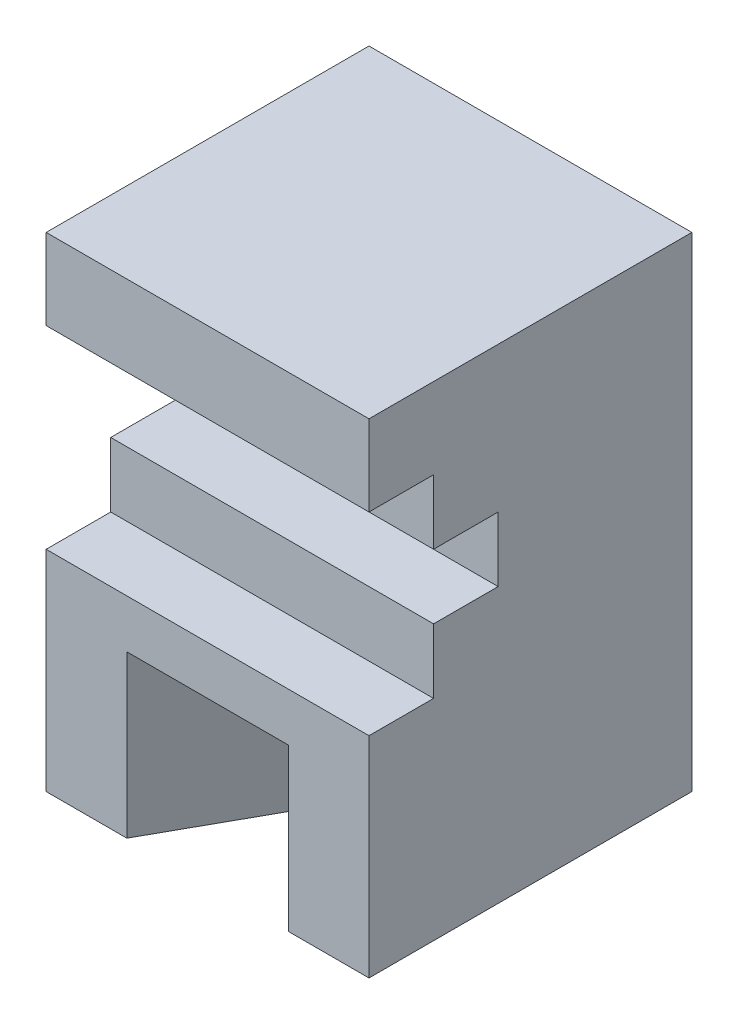
ISO-10303-21;
HEADER;
FILE_DESCRIPTION(('STEP AP214'),'2;1');
FILE_NAME('part.step','',(''),(''),'','','');
FILE_SCHEMA(('AUTOMOTIVE_DESIGN { 1 0 10303 214 1 1 1 1 }'));
ENDSEC;
DATA;
#1=APPLICATION_CONTEXT('core data for automotive mechanical design processes');
#2=APPLICATION_PROTOCOL_DEFINITION('international standard','automotive_design',2000,#1);
#3=PRODUCT_CONTEXT('',#1,'mechanical');
#4=PRODUCT('Part','Part','',(#3));
#5=PRODUCT_RELATED_PRODUCT_CATEGORY('part','',(#4));
#6=PRODUCT_DEFINITION_FORMATION('','',#4);
#7=PRODUCT_DEFINITION_CONTEXT('part definition',#1,'design');
#8=PRODUCT_DEFINITION('design','',#6,#7);
#9=PRODUCT_DEFINITION_SHAPE('','',#8);
#10=(LENGTH_UNIT() NAMED_UNIT(*) SI_UNIT(.MILLI.,.METRE.));
#11=(NAMED_UNIT(*) PLANE_ANGLE_UNIT() SI_UNIT($,.RADIAN.));
#12=(NAMED_UNIT(*) SI_UNIT($,.STERADIAN.) SOLID_ANGLE_UNIT());
#13=UNCERTAINTY_MEASURE_WITH_UNIT(LENGTH_MEASURE(1.E-05),#10,'distance_accuracy_value','');
#14=(GEOMETRIC_REPRESENTATION_CONTEXT(3) GLOBAL_UNCERTAINTY_ASSIGNED_CONTEXT((#13)) GLOBAL_UNIT_ASSIGNED_CONTEXT((#10,
#11,#12)) REPRESENTATION_CONTEXT('',''));
#15=CARTESIAN_POINT('',(0.,0.,0.));
#16=DIRECTION('',(0.,0.,1.));
#17=DIRECTION('',(1.,0.,0.));
#18=AXIS2_PLACEMENT_3D('',#15,#16,#17);
#19=CARTESIAN_POINT('',(0.,0.,0.));
#20=DIRECTION('',(0.,0.,-1.));
#21=DIRECTION('',(-1.,0.,0.));
#22=AXIS2_PLACEMENT_3D('',#19,#20,#21);
#23=PLANE('',#22);
#24=DIRECTION('',(0.,1.,0.));
#25=VECTOR('',#24,1.);
#26=CARTESIAN_POINT('',(100.,0.,0.));
#27=LINE('',#26,#25);
#28=CARTESIAN_POINT('',(100.,0.,0.));
#29=VERTEX_POINT('',#28);
#30=CARTESIAN_POINT('',(100.,65.,0.));
#31=VERTEX_POINT('',#30);
#32=EDGE_CURVE('E296',#29,#31,#27,.T.);
#33=ORIENTED_EDGE('',*,*,#32,.T.);
#34=DIRECTION('',(-1.,0.,0.));
#35=VECTOR('',#34,1.);
#36=CARTESIAN_POINT('',(100.,65.,0.));
#37=LINE('',#36,#35);
#38=CARTESIAN_POINT('',(0.,65.,0.));
#39=VERTEX_POINT('',#38);
#40=EDGE_CURVE('E224',#31,#39,#37,.T.);
#41=ORIENTED_EDGE('',*,*,#40,.T.);
#42=DIRECTION('',(0.,-1.,0.));
#43=VECTOR('',#42,1.);
#44=CARTESIAN_POINT('',(0.,0.,0.));
#45=LINE('',#44,#43);
#46=CARTESIAN_POINT('',(0.,0.,0.));
#47=VERTEX_POINT('',#46);
#48=EDGE_CURVE('E264',#39,#47,#45,.T.);
#49=ORIENTED_EDGE('',*,*,#48,.T.);
#50=DIRECTION('',(1.,0.,0.));
#51=VECTOR('',#50,1.);
#52=CARTESIAN_POINT('',(0.,0.,0.));
#53=LINE('',#52,#51);
#54=CARTESIAN_POINT('',(25.,0.,0.));
#55=VERTEX_POINT('',#54);
#56=EDGE_CURVE('E292',#47,#55,#53,.T.);
#57=ORIENTED_EDGE('',*,*,#56,.T.);
#58=DIRECTION('',(0.,-1.,0.));
#59=VECTOR('',#58,1.);
#60=CARTESIAN_POINT('',(25.,50.,0.));
#61=LINE('',#60,#59);
#62=CARTESIAN_POINT('',(25.,50.,0.));
#63=VERTEX_POINT('',#62);
#64=EDGE_CURVE('E254',#63,#55,#61,.T.);
#65=ORIENTED_EDGE('',*,*,#64,.F.);
#66=DIRECTION('',(-1.,0.,0.));
#67=VECTOR('',#66,1.);
#68=CARTESIAN_POINT('',(75.,50.,0.));
#69=LINE('',#68,#67);
#70=CARTESIAN_POINT('',(75.,50.,0.));
#71=VERTEX_POINT('',#70);
#72=EDGE_CURVE('E245',#71,#63,#69,.T.);
#73=ORIENTED_EDGE('',*,*,#72,.F.);
#74=DIRECTION('',(0.,-1.,0.));
#75=VECTOR('',#74,1.);
#76=CARTESIAN_POINT('',(75.,50.,0.));
#77=LINE('',#76,#75);
#78=CARTESIAN_POINT('',(75.,0.,0.));
#79=VERTEX_POINT('',#78);
#80=EDGE_CURVE('E260',#71,#79,#77,.T.);
#81=ORIENTED_EDGE('',*,*,#80,.T.);
#82=EDGE_CURVE('E291',#79,#29,#53,.T.);
#83=ORIENTED_EDGE('',*,*,#82,.T.);
#84=EDGE_LOOP('',(#33,#41,#49,#57,#65,#73,#81,#83));
#85=FACE_BOUND('',#84,.T.);
#86=ADVANCED_FACE('F45',(#85),#23,.F.);
#87=CARTESIAN_POINT('',(0.,0.,-100.));
#88=DIRECTION('',(-1.,0.,0.));
#89=DIRECTION('',(0.,0.,1.));
#90=AXIS2_PLACEMENT_3D('',#87,#88,#89);
#91=PLANE('',#90);
#92=DIRECTION('',(0.,0.,1.));
#93=VECTOR('',#92,1.);
#94=CARTESIAN_POINT('',(0.,65.,-20.));
#95=LINE('',#94,#93);
#96=CARTESIAN_POINT('',(0.,65.,-20.));
#97=VERTEX_POINT('',#96);
#98=EDGE_CURVE('E181',#97,#39,#95,.T.);
#99=ORIENTED_EDGE('',*,*,#98,.F.);
#100=DIRECTION('',(0.,-1.,0.));
#101=VECTOR('',#100,1.);
#102=CARTESIAN_POINT('',(0.,85.,-20.));
#103=LINE('',#102,#101);
#104=CARTESIAN_POINT('',(0.,85.,-20.));
#105=VERTEX_POINT('',#104);
#106=EDGE_CURVE('E184',#105,#97,#103,.T.);
#107=ORIENTED_EDGE('',*,*,#106,.F.);
#108=DIRECTION('',(0.,0.,1.));
#109=VECTOR('',#108,1.);
#110=CARTESIAN_POINT('',(0.,85.,-40.));
#111=LINE('',#110,#109);
#112=CARTESIAN_POINT('',(0.,85.,-40.));
#113=VERTEX_POINT('',#112);
#114=EDGE_CURVE('E217',#113,#105,#111,.T.);
#115=ORIENTED_EDGE('',*,*,#114,.F.);
#116=DIRECTION('',(0.,-1.,0.));
#117=VECTOR('',#116,1.);
#118=CARTESIAN_POINT('',(0.,105.,-40.));
#119=LINE('',#118,#117);
#120=CARTESIAN_POINT('',(0.,105.,-40.));
#121=VERTEX_POINT('',#120);
#122=EDGE_CURVE('E213',#121,#113,#119,.T.);
#123=ORIENTED_EDGE('',*,*,#122,.F.);
#124=DIRECTION('',(0.,0.,-1.));
#125=VECTOR('',#124,1.);
#126=CARTESIAN_POINT('',(0.,105.,-20.));
#127=LINE('',#126,#125);
#128=CARTESIAN_POINT('',(0.,105.,-20.));
#129=VERTEX_POINT('',#128);
#130=EDGE_CURVE('E209',#129,#121,#127,.T.);
#131=ORIENTED_EDGE('',*,*,#130,.F.);
#132=DIRECTION('',(0.,-1.,0.));
#133=VECTOR('',#132,1.);
#134=CARTESIAN_POINT('',(0.,125.,-20.));
#135=LINE('',#134,#133);
#136=CARTESIAN_POINT('',(0.,125.,-20.));
#137=VERTEX_POINT('',#136);
#138=EDGE_CURVE('E206',#137,#129,#135,.T.);
#139=ORIENTED_EDGE('',*,*,#138,.F.);
#140=DIRECTION('',(0.,0.,-1.));
#141=VECTOR('',#140,1.);
#142=CARTESIAN_POINT('',(0.,125.,0.));
#143=LINE('',#142,#141);
#144=CARTESIAN_POINT('',(0.,125.,0.));
#145=VERTEX_POINT('',#144);
#146=EDGE_CURVE('E158',#145,#137,#143,.T.);
#147=ORIENTED_EDGE('',*,*,#146,.F.);
#148=CARTESIAN_POINT('',(0.,150.,0.));
#149=VERTEX_POINT('',#148);
#150=EDGE_CURVE('E287',#149,#145,#45,.T.);
#151=ORIENTED_EDGE('',*,*,#150,.F.);
#152=DIRECTION('',(0.,0.,1.));
#153=VECTOR('',#152,1.);
#154=CARTESIAN_POINT('',(0.,150.,-100.));
#155=LINE('',#154,#153);
#156=CARTESIAN_POINT('',(0.,150.,-100.));
#157=VERTEX_POINT('',#156);
#158=EDGE_CURVE('E11',#157,#149,#155,.T.);
#159=ORIENTED_EDGE('',*,*,#158,.F.);
#160=DIRECTION('',(0.,-1.,0.));
#161=VECTOR('',#160,1.);
#162=CARTESIAN_POINT('',(0.,0.,-100.));
#163=LINE('',#162,#161);
#164=CARTESIAN_POINT('',(0.,0.,-100.));
#165=VERTEX_POINT('',#164);
#166=EDGE_CURVE('E270',#157,#165,#163,.T.);
#167=ORIENTED_EDGE('',*,*,#166,.T.);
#168=DIRECTION('',(0.,0.,1.));
#169=VECTOR('',#168,1.);
#170=CARTESIAN_POINT('',(0.,0.,-100.));
#171=LINE('',#170,#169);
#172=EDGE_CURVE('E49',#165,#47,#171,.T.);
#173=ORIENTED_EDGE('',*,*,#172,.T.);
#174=ORIENTED_EDGE('',*,*,#48,.F.);
#175=EDGE_LOOP('',(#99,#107,#115,#123,#131,#139,#147,#151,#159,#167,#173,#174));
#176=FACE_BOUND('',#175,.T.);
#177=ADVANCED_FACE('F47',(#176),#91,.T.);
#178=CARTESIAN_POINT('',(0.,150.,-100.));
#179=DIRECTION('',(0.,1.,0.));
#180=DIRECTION('',(0.,0.,1.));
#181=AXIS2_PLACEMENT_3D('',#178,#179,#180);
#182=PLANE('',#181);
#183=DIRECTION('',(-1.,0.,0.));
#184=VECTOR('',#183,1.);
#185=CARTESIAN_POINT('',(0.,150.,0.));
#186=LINE('',#185,#184);
#187=CARTESIAN_POINT('',(100.,150.,0.));
#188=VERTEX_POINT('',#187);
#189=EDGE_CURVE('E275',#188,#149,#186,.T.);
#190=ORIENTED_EDGE('',*,*,#189,.F.);
#191=DIRECTION('',(0.,0.,1.));
#192=VECTOR('',#191,1.);
#193=CARTESIAN_POINT('',(100.,150.,-100.));
#194=LINE('',#193,#192);
#195=CARTESIAN_POINT('',(100.,150.,-100.));
#196=VERTEX_POINT('',#195);
#197=EDGE_CURVE('E55',#196,#188,#194,.T.);
#198=ORIENTED_EDGE('',*,*,#197,.F.);
#199=DIRECTION('',(-1.,0.,0.));
#200=VECTOR('',#199,1.);
#201=CARTESIAN_POINT('',(0.,150.,-100.));
#202=LINE('',#201,#200);
#203=EDGE_CURVE('E283',#196,#157,#202,.T.);
#204=ORIENTED_EDGE('',*,*,#203,.T.);
#205=ORIENTED_EDGE('',*,*,#158,.T.);
#206=EDGE_LOOP('',(#190,#198,#204,#205));
#207=FACE_BOUND('',#206,.T.);
#208=ADVANCED_FACE('F333',(#207),#182,.T.);
#209=CARTESIAN_POINT('',(100.,0.,-100.));
#210=DIRECTION('',(1.,0.,0.));
#211=DIRECTION('',(0.,0.,-1.));
#212=AXIS2_PLACEMENT_3D('',#209,#210,#211);
#213=PLANE('',#212);
#214=DIRECTION('',(0.,0.,1.));
#215=VECTOR('',#214,1.);
#216=CARTESIAN_POINT('',(100.,65.,-20.));
#217=LINE('',#216,#215);
#218=CARTESIAN_POINT('',(100.,65.,-20.));
#219=VERTEX_POINT('',#218);
#220=EDGE_CURVE('E201',#219,#31,#217,.T.);
#221=ORIENTED_EDGE('',*,*,#220,.T.);
#222=ORIENTED_EDGE('',*,*,#32,.F.);
#223=DIRECTION('',(0.,0.,1.));
#224=VECTOR('',#223,1.);
#225=CARTESIAN_POINT('',(100.,0.,-100.));
#226=LINE('',#225,#224);
#227=CARTESIAN_POINT('',(100.,0.,-100.));
#228=VERTEX_POINT('',#227);
#229=EDGE_CURVE('E304',#228,#29,#226,.T.);
#230=ORIENTED_EDGE('',*,*,#229,.F.);
#231=DIRECTION('',(0.,1.,0.));
#232=VECTOR('',#231,1.);
#233=CARTESIAN_POINT('',(100.,0.,-100.));
#234=LINE('',#233,#232);
#235=EDGE_CURVE('E279',#228,#196,#234,.T.);
#236=ORIENTED_EDGE('',*,*,#235,.T.);
#237=ORIENTED_EDGE('',*,*,#197,.T.);
#238=CARTESIAN_POINT('',(100.,125.,0.));
#239=VERTEX_POINT('',#238);
#240=EDGE_CURVE('E179',#239,#188,#27,.T.);
#241=ORIENTED_EDGE('',*,*,#240,.F.);
#242=DIRECTION('',(0.,0.,-1.));
#243=VECTOR('',#242,1.);
#244=CARTESIAN_POINT('',(100.,125.,0.));
#245=LINE('',#244,#243);
#246=CARTESIAN_POINT('',(100.,125.,-20.));
#247=VERTEX_POINT('',#246);
#248=EDGE_CURVE('E63',#239,#247,#245,.T.);
#249=ORIENTED_EDGE('',*,*,#248,.T.);
#250=DIRECTION('',(0.,-1.,0.));
#251=VECTOR('',#250,1.);
#252=CARTESIAN_POINT('',(100.,125.,-20.));
#253=LINE('',#252,#251);
#254=CARTESIAN_POINT('',(100.,105.,-20.));
#255=VERTEX_POINT('',#254);
#256=EDGE_CURVE('E167',#247,#255,#253,.T.);
#257=ORIENTED_EDGE('',*,*,#256,.T.);
#258=DIRECTION('',(0.,0.,-1.));
#259=VECTOR('',#258,1.);
#260=CARTESIAN_POINT('',(100.,105.,-20.));
#261=LINE('',#260,#259);
#262=CARTESIAN_POINT('',(100.,105.,-40.));
#263=VERTEX_POINT('',#262);
#264=EDGE_CURVE('E173',#255,#263,#261,.T.);
#265=ORIENTED_EDGE('',*,*,#264,.T.);
#266=DIRECTION('',(0.,-1.,0.));
#267=VECTOR('',#266,1.);
#268=CARTESIAN_POINT('',(100.,105.,-40.));
#269=LINE('',#268,#267);
#270=CARTESIAN_POINT('',(100.,85.,-40.));
#271=VERTEX_POINT('',#270);
#272=EDGE_CURVE('E189',#263,#271,#269,.T.);
#273=ORIENTED_EDGE('',*,*,#272,.T.);
#274=DIRECTION('',(0.,0.,1.));
#275=VECTOR('',#274,1.);
#276=CARTESIAN_POINT('',(100.,85.,-40.));
#277=LINE('',#276,#275);
#278=CARTESIAN_POINT('',(100.,85.,-20.));
#279=VERTEX_POINT('',#278);
#280=EDGE_CURVE('E193',#271,#279,#277,.T.);
#281=ORIENTED_EDGE('',*,*,#280,.T.);
#282=DIRECTION('',(0.,-1.,0.));
#283=VECTOR('',#282,1.);
#284=CARTESIAN_POINT('',(100.,85.,-20.));
#285=LINE('',#284,#283);
#286=EDGE_CURVE('E197',#279,#219,#285,.T.);
#287=ORIENTED_EDGE('',*,*,#286,.T.);
#288=EDGE_LOOP('',(#221,#222,#230,#236,#237,#241,#249,#257,#265,#273,#281,#287));
#289=FACE_BOUND('',#288,.T.);
#290=ADVANCED_FACE('F177',(#289),#213,.T.);
#291=CARTESIAN_POINT('',(0.,0.,-100.));
#292=DIRECTION('',(0.,-1.,0.));
#293=DIRECTION('',(0.,0.,-1.));
#294=AXIS2_PLACEMENT_3D('',#291,#292,#293);
#295=PLANE('',#294);
#296=DIRECTION('',(0.485642931178632,0.,0.874157276121538));
#297=VECTOR('',#296,1.);
#298=CARTESIAN_POINT('',(50.,0.,-45.));
#299=LINE('',#298,#297);
#300=CARTESIAN_POINT('',(50.,0.,-45.));
#301=VERTEX_POINT('',#300);
#302=EDGE_CURVE('E249',#301,#79,#299,.T.);
#303=ORIENTED_EDGE('',*,*,#302,.F.);
#304=DIRECTION('',(0.485642931178632,0.,-0.874157276121538));
#305=VECTOR('',#304,1.);
#306=CARTESIAN_POINT('',(25.,0.,0.));
#307=LINE('',#306,#305);
#308=EDGE_CURVE('E228',#55,#301,#307,.T.);
#309=ORIENTED_EDGE('',*,*,#308,.F.);
#310=ORIENTED_EDGE('',*,*,#56,.F.);
#311=ORIENTED_EDGE('',*,*,#172,.F.);
#312=DIRECTION('',(1.,0.,0.));
#313=VECTOR('',#312,1.);
#314=CARTESIAN_POINT('',(0.,0.,-100.));
#315=LINE('',#314,#313);
#316=EDGE_CURVE('E274',#165,#228,#315,.T.);
#317=ORIENTED_EDGE('',*,*,#316,.T.);
#318=ORIENTED_EDGE('',*,*,#229,.T.);
#319=ORIENTED_EDGE('',*,*,#82,.F.);
#320=EDGE_LOOP('',(#303,#309,#310,#311,#317,#318,#319));
#321=FACE_BOUND('',#320,.T.);
#322=ADVANCED_FACE('F320',(#321),#295,.T.);
#323=CARTESIAN_POINT('',(0.,0.,-100.));
#324=DIRECTION('',(0.,0.,-1.));
#325=DIRECTION('',(-1.,0.,0.));
#326=AXIS2_PLACEMENT_3D('',#323,#324,#325);
#327=PLANE('',#326);
#328=ORIENTED_EDGE('',*,*,#166,.F.);
#329=ORIENTED_EDGE('',*,*,#203,.F.);
#330=ORIENTED_EDGE('',*,*,#235,.F.);
#331=ORIENTED_EDGE('',*,*,#316,.F.);
#332=EDGE_LOOP('',(#328,#329,#330,#331));
#333=FACE_BOUND('',#332,.T.);
#334=ADVANCED_FACE('F376',(#333),#327,.T.);
#335=ORIENTED_EDGE('',*,*,#150,.T.);
#336=DIRECTION('',(-1.,0.,0.));
#337=VECTOR('',#336,1.);
#338=CARTESIAN_POINT('',(100.,125.,0.));
#339=LINE('',#338,#337);
#340=EDGE_CURVE('E164',#239,#145,#339,.T.);
#341=ORIENTED_EDGE('',*,*,#340,.F.);
#342=ORIENTED_EDGE('',*,*,#240,.T.);
#343=ORIENTED_EDGE('',*,*,#189,.T.);
#344=EDGE_LOOP('',(#335,#341,#342,#343));
#345=FACE_BOUND('',#344,.T.);
#346=ADVANCED_FACE('F328',(#345),#23,.F.);
#347=CARTESIAN_POINT('',(50.,50.,-45.));
#348=DIRECTION('',(0.874157276121538,0.,-0.485642931178632));
#349=DIRECTION('',(-0.485642931178632,0.,-0.874157276121538));
#350=AXIS2_PLACEMENT_3D('',#347,#348,#349);
#351=PLANE('',#350);
#352=ORIENTED_EDGE('',*,*,#302,.T.);
#353=ORIENTED_EDGE('',*,*,#80,.F.);
#354=DIRECTION('',(0.485642931178632,0.,0.874157276121538));
#355=VECTOR('',#354,1.);
#356=CARTESIAN_POINT('',(50.,50.,-45.));
#357=LINE('',#356,#355);
#358=CARTESIAN_POINT('',(50.,50.,-45.));
#359=VERTEX_POINT('',#358);
#360=EDGE_CURVE('E71',#359,#71,#357,.T.);
#361=ORIENTED_EDGE('',*,*,#360,.F.);
#362=DIRECTION('',(0.,-1.,0.));
#363=VECTOR('',#362,1.);
#364=CARTESIAN_POINT('',(50.,50.,-45.));
#365=LINE('',#364,#363);
#366=EDGE_CURVE('E265',#359,#301,#365,.T.);
#367=ORIENTED_EDGE('',*,*,#366,.T.);
#368=EDGE_LOOP('',(#352,#353,#361,#367));
#369=FACE_BOUND('',#368,.T.);
#370=ADVANCED_FACE('F353',(#369),#351,.F.);
#371=CARTESIAN_POINT('',(25.,50.,0.));
#372=DIRECTION('',(-0.874157276121538,0.,-0.485642931178632));
#373=DIRECTION('',(-0.485642931178632,0.,0.874157276121538));
#374=AXIS2_PLACEMENT_3D('',#371,#372,#373);
#375=PLANE('',#374);
#376=ORIENTED_EDGE('',*,*,#308,.T.);
#377=ORIENTED_EDGE('',*,*,#366,.F.);
#378=DIRECTION('',(0.485642931178632,0.,-0.874157276121538));
#379=VECTOR('',#378,1.);
#380=CARTESIAN_POINT('',(25.,50.,0.));
#381=LINE('',#380,#379);
#382=EDGE_CURVE('E248',#63,#359,#381,.T.);
#383=ORIENTED_EDGE('',*,*,#382,.F.);
#384=ORIENTED_EDGE('',*,*,#64,.T.);
#385=EDGE_LOOP('',(#376,#377,#383,#384));
#386=FACE_BOUND('',#385,.T.);
#387=ADVANCED_FACE('F355',(#386),#375,.F.);
#388=CARTESIAN_POINT('',(0.,50.,0.));
#389=DIRECTION('',(0.,-1.,0.));
#390=DIRECTION('',(0.,0.,-1.));
#391=AXIS2_PLACEMENT_3D('',#388,#389,#390);
#392=PLANE('',#391);
#393=ORIENTED_EDGE('',*,*,#72,.T.);
#394=ORIENTED_EDGE('',*,*,#382,.T.);
#395=ORIENTED_EDGE('',*,*,#360,.T.);
#396=EDGE_LOOP('',(#393,#394,#395));
#397=FACE_BOUND('',#396,.T.);
#398=ADVANCED_FACE('F356',(#397),#392,.T.);
#399=CARTESIAN_POINT('',(100.,65.,-20.));
#400=DIRECTION('',(0.,-1.,0.));
#401=DIRECTION('',(0.,0.,-1.));
#402=AXIS2_PLACEMENT_3D('',#399,#400,#401);
#403=PLANE('',#402);
#404=ORIENTED_EDGE('',*,*,#98,.T.);
#405=ORIENTED_EDGE('',*,*,#40,.F.);
#406=ORIENTED_EDGE('',*,*,#220,.F.);
#407=DIRECTION('',(-1.,0.,0.));
#408=VECTOR('',#407,1.);
#409=CARTESIAN_POINT('',(100.,65.,-20.));
#410=LINE('',#409,#408);
#411=EDGE_CURVE('E229',#219,#97,#410,.T.);
#412=ORIENTED_EDGE('',*,*,#411,.T.);
#413=EDGE_LOOP('',(#404,#405,#406,#412));
#414=FACE_BOUND('',#413,.T.);
#415=ADVANCED_FACE('F358',(#414),#403,.F.);
#416=CARTESIAN_POINT('',(100.,85.,-20.));
#417=DIRECTION('',(0.,0.,-1.));
#418=DIRECTION('',(0.,1.,0.));
#419=AXIS2_PLACEMENT_3D('',#416,#417,#418);
#420=PLANE('',#419);
#421=ORIENTED_EDGE('',*,*,#106,.T.);
#422=ORIENTED_EDGE('',*,*,#411,.F.);
#423=ORIENTED_EDGE('',*,*,#286,.F.);
#424=DIRECTION('',(-1.,0.,0.));
#425=VECTOR('',#424,1.);
#426=CARTESIAN_POINT('',(100.,85.,-20.));
#427=LINE('',#426,#425);
#428=EDGE_CURVE('E232',#279,#105,#427,.T.);
#429=ORIENTED_EDGE('',*,*,#428,.T.);
#430=EDGE_LOOP('',(#421,#422,#423,#429));
#431=FACE_BOUND('',#430,.T.);
#432=ADVANCED_FACE('F349',(#431),#420,.F.);
#433=CARTESIAN_POINT('',(100.,85.,-40.));
#434=DIRECTION('',(0.,-1.,0.));
#435=DIRECTION('',(0.,0.,-1.));
#436=AXIS2_PLACEMENT_3D('',#433,#434,#435);
#437=PLANE('',#436);
#438=ORIENTED_EDGE('',*,*,#114,.T.);
#439=ORIENTED_EDGE('',*,*,#428,.F.);
#440=ORIENTED_EDGE('',*,*,#280,.F.);
#441=DIRECTION('',(-1.,0.,0.));
#442=VECTOR('',#441,1.);
#443=CARTESIAN_POINT('',(100.,85.,-40.));
#444=LINE('',#443,#442);
#445=EDGE_CURVE('E235',#271,#113,#444,.T.);
#446=ORIENTED_EDGE('',*,*,#445,.T.);
#447=EDGE_LOOP('',(#438,#439,#440,#446));
#448=FACE_BOUND('',#447,.T.);
#449=ADVANCED_FACE('F345',(#448),#437,.F.);
#450=CARTESIAN_POINT('',(100.,105.,-40.));
#451=DIRECTION('',(0.,0.,-1.));
#452=DIRECTION('',(-1.,0.,0.));
#453=AXIS2_PLACEMENT_3D('',#450,#451,#452);
#454=PLANE('',#453);
#455=ORIENTED_EDGE('',*,*,#122,.T.);
#456=ORIENTED_EDGE('',*,*,#445,.F.);
#457=ORIENTED_EDGE('',*,*,#272,.F.);
#458=DIRECTION('',(-1.,0.,0.));
#459=VECTOR('',#458,1.);
#460=CARTESIAN_POINT('',(100.,105.,-40.));
#461=LINE('',#460,#459);
#462=EDGE_CURVE('E238',#263,#121,#461,.T.);
#463=ORIENTED_EDGE('',*,*,#462,.T.);
#464=EDGE_LOOP('',(#455,#456,#457,#463));
#465=FACE_BOUND('',#464,.T.);
#466=ADVANCED_FACE('F343',(#465),#454,.F.);
#467=CARTESIAN_POINT('',(100.,105.,-20.));
#468=DIRECTION('',(0.,1.,0.));
#469=DIRECTION('',(0.,0.,1.));
#470=AXIS2_PLACEMENT_3D('',#467,#468,#469);
#471=PLANE('',#470);
#472=ORIENTED_EDGE('',*,*,#130,.T.);
#473=ORIENTED_EDGE('',*,*,#462,.F.);
#474=ORIENTED_EDGE('',*,*,#264,.F.);
#475=DIRECTION('',(-1.,0.,0.));
#476=VECTOR('',#475,1.);
#477=CARTESIAN_POINT('',(100.,105.,-20.));
#478=LINE('',#477,#476);
#479=EDGE_CURVE('E163',#255,#129,#478,.T.);
#480=ORIENTED_EDGE('',*,*,#479,.T.);
#481=EDGE_LOOP('',(#472,#473,#474,#480));
#482=FACE_BOUND('',#481,.T.);
#483=ADVANCED_FACE('F339',(#482),#471,.F.);
#484=CARTESIAN_POINT('',(100.,125.,-20.));
#485=DIRECTION('',(0.,0.,-1.));
#486=DIRECTION('',(0.,1.,0.));
#487=AXIS2_PLACEMENT_3D('',#484,#485,#486);
#488=PLANE('',#487);
#489=ORIENTED_EDGE('',*,*,#138,.T.);
#490=ORIENTED_EDGE('',*,*,#479,.F.);
#491=ORIENTED_EDGE('',*,*,#256,.F.);
#492=DIRECTION('',(-1.,0.,0.));
#493=VECTOR('',#492,1.);
#494=CARTESIAN_POINT('',(100.,125.,-20.));
#495=LINE('',#494,#493);
#496=EDGE_CURVE('E154',#247,#137,#495,.T.);
#497=ORIENTED_EDGE('',*,*,#496,.T.);
#498=EDGE_LOOP('',(#489,#490,#491,#497));
#499=FACE_BOUND('',#498,.T.);
#500=ADVANCED_FACE('F168',(#499),#488,.F.);
#501=CARTESIAN_POINT('',(100.,125.,0.));
#502=DIRECTION('',(0.,1.,0.));
#503=DIRECTION('',(0.,0.,1.));
#504=AXIS2_PLACEMENT_3D('',#501,#502,#503);
#505=PLANE('',#504);
#506=ORIENTED_EDGE('',*,*,#146,.T.);
#507=ORIENTED_EDGE('',*,*,#496,.F.);
#508=ORIENTED_EDGE('',*,*,#248,.F.);
#509=ORIENTED_EDGE('',*,*,#340,.T.);
#510=EDGE_LOOP('',(#506,#507,#508,#509));
#511=FACE_BOUND('',#510,.T.);
#512=ADVANCED_FACE('F156',(#511),#505,.F.);
#513=CLOSED_SHELL('',(#86,#177,#208,#290,#322,#334,#346,#370,#387,#398,#415,#432,#449,#466,#483,
#500,#512));
#514=MANIFOLD_SOLID_BREP('B2',#513);
#515=ADVANCED_BREP_SHAPE_REPRESENTATION('',(#18,#514),#14);
#516=SHAPE_DEFINITION_REPRESENTATION(#9,#515);
ENDSEC;
END-ISO-10303-21;
